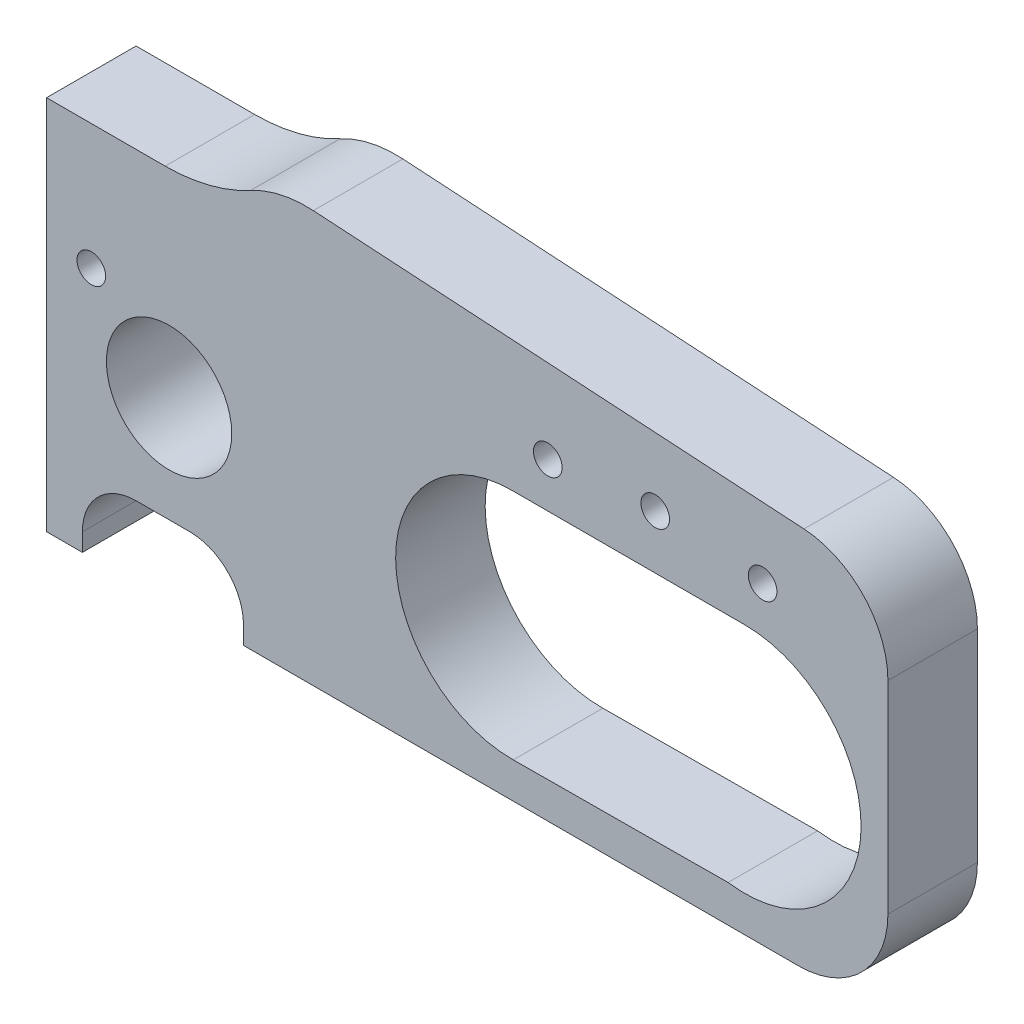
ISO-10303-21;
HEADER;
FILE_DESCRIPTION(('STEP AP214'),'2;1');
FILE_NAME('part.step','',(''),(''),'','','');
FILE_SCHEMA(('AUTOMOTIVE_DESIGN { 1 0 10303 214 1 1 1 1 }'));
ENDSEC;
DATA;
#1=APPLICATION_CONTEXT('core data for automotive mechanical design processes');
#2=APPLICATION_PROTOCOL_DEFINITION('international standard','automotive_design',2000,#1);
#3=PRODUCT_CONTEXT('',#1,'mechanical');
#4=PRODUCT('Part','Part','',(#3));
#5=PRODUCT_RELATED_PRODUCT_CATEGORY('part','',(#4));
#6=PRODUCT_DEFINITION_FORMATION('','',#4);
#7=PRODUCT_DEFINITION_CONTEXT('part definition',#1,'design');
#8=PRODUCT_DEFINITION('design','',#6,#7);
#9=PRODUCT_DEFINITION_SHAPE('','',#8);
#10=(LENGTH_UNIT() NAMED_UNIT(*) SI_UNIT(.MILLI.,.METRE.));
#11=(NAMED_UNIT(*) PLANE_ANGLE_UNIT() SI_UNIT($,.RADIAN.));
#12=(NAMED_UNIT(*) SI_UNIT($,.STERADIAN.) SOLID_ANGLE_UNIT());
#13=UNCERTAINTY_MEASURE_WITH_UNIT(LENGTH_MEASURE(1.E-05),#10,'distance_accuracy_value','');
#14=(GEOMETRIC_REPRESENTATION_CONTEXT(3) GLOBAL_UNCERTAINTY_ASSIGNED_CONTEXT((#13)) GLOBAL_UNIT_ASSIGNED_CONTEXT((#10,
#11,#12)) REPRESENTATION_CONTEXT('',''));
#15=CARTESIAN_POINT('',(0.,0.,0.));
#16=DIRECTION('',(0.,0.,1.));
#17=DIRECTION('',(1.,0.,0.));
#18=AXIS2_PLACEMENT_3D('',#15,#16,#17);
#19=CARTESIAN_POINT('',(0.,-8.37631575705552,5.));
#20=DIRECTION('',(0.,1.,0.));
#21=DIRECTION('',(-1.,0.,0.));
#22=AXIS2_PLACEMENT_3D('',#19,#20,#21);
#23=PLANE('',#22);
#24=DIRECTION('',(0.,0.,-1.));
#25=VECTOR('',#24,1.);
#26=CARTESIAN_POINT('',(-21.9381578785278,-8.37631575705552,10.));
#27=LINE('',#26,#25);
#28=CARTESIAN_POINT('',(-21.9381578785278,-8.37631575705552,5.));
#29=VERTEX_POINT('',#28);
#30=CARTESIAN_POINT('',(-21.9381578785278,-8.37631575705552,0.));
#31=VERTEX_POINT('',#30);
#32=EDGE_CURVE('E187',#29,#31,#27,.T.);
#33=ORIENTED_EDGE('',*,*,#32,.F.);
#34=DIRECTION('',(1.,0.,0.));
#35=VECTOR('',#34,1.);
#36=CARTESIAN_POINT('',(0.,-8.37631575705552,5.));
#37=LINE('',#36,#35);
#38=CARTESIAN_POINT('',(-23.9381578785278,-8.37631575705552,5.));
#39=VERTEX_POINT('',#38);
#40=EDGE_CURVE('E331',#39,#29,#37,.T.);
#41=ORIENTED_EDGE('',*,*,#40,.F.);
#42=DIRECTION('',(0.,0.,-1.));
#43=VECTOR('',#42,1.);
#44=CARTESIAN_POINT('',(-23.9381578785278,-8.37631575705552,5.));
#45=LINE('',#44,#43);
#46=CARTESIAN_POINT('',(-23.9381578785278,-8.37631575705552,0.));
#47=VERTEX_POINT('',#46);
#48=EDGE_CURVE('E211',#39,#47,#45,.T.);
#49=ORIENTED_EDGE('',*,*,#48,.T.);
#50=DIRECTION('',(1.,0.,0.));
#51=VECTOR('',#50,1.);
#52=CARTESIAN_POINT('',(0.,-8.37631575705552,0.));
#53=LINE('',#52,#51);
#54=EDGE_CURVE('E198',#47,#31,#53,.T.);
#55=ORIENTED_EDGE('',*,*,#54,.T.);
#56=EDGE_LOOP('',(#33,#41,#49,#55));
#57=FACE_BOUND('',#56,.T.);
#58=ADVANCED_FACE('F45',(#57),#23,.F.);
#59=CARTESIAN_POINT('',(0.,0.,0.));
#60=DIRECTION('',(0.,0.,1.));
#61=DIRECTION('',(1.,0.,0.));
#62=AXIS2_PLACEMENT_3D('',#59,#60,#61);
#63=PLANE('',#62);
#64=CARTESIAN_POINT('',(-21.4381578785278,5.62368424294448,0.));
#65=DIRECTION('',(0.,0.,1.));
#66=DIRECTION('',(1.,0.,0.));
#67=AXIS2_PLACEMENT_3D('',#64,#65,#66);
#68=CIRCLE('',#67,0.8);
#69=CARTESIAN_POINT('',(-20.6381578785278,5.62368424294448,0.));
#70=VERTEX_POINT('',#69);
#71=EDGE_CURVE('E364',#70,#70,#68,.T.);
#72=ORIENTED_EDGE('',*,*,#71,.T.);
#73=EDGE_LOOP('',(#72));
#74=FACE_BOUND('',#73,.T.);
#75=CARTESIAN_POINT('',(4.06184212147224,9.12368424294448,0.));
#76=DIRECTION('',(0.,0.,1.));
#77=DIRECTION('',(1.,0.,0.));
#78=AXIS2_PLACEMENT_3D('',#75,#76,#77);
#79=CIRCLE('',#78,0.800000000000001);
#80=CARTESIAN_POINT('',(4.86184212147224,9.12368424294448,0.));
#81=VERTEX_POINT('',#80);
#82=EDGE_CURVE('E358',#81,#81,#79,.T.);
#83=ORIENTED_EDGE('',*,*,#82,.T.);
#84=EDGE_LOOP('',(#83));
#85=FACE_BOUND('',#84,.T.);
#86=CARTESIAN_POINT('',(10.0618421214722,9.62368424294448,0.));
#87=DIRECTION('',(0.,0.,1.));
#88=DIRECTION('',(1.,0.,0.));
#89=AXIS2_PLACEMENT_3D('',#86,#87,#88);
#90=CIRCLE('',#89,0.800000000000002);
#91=CARTESIAN_POINT('',(10.8618421214722,9.62368424294448,0.));
#92=VERTEX_POINT('',#91);
#93=EDGE_CURVE('E360',#92,#92,#90,.T.);
#94=ORIENTED_EDGE('',*,*,#93,.T.);
#95=EDGE_LOOP('',(#94));
#96=FACE_BOUND('',#95,.T.);
#97=CARTESIAN_POINT('',(16.0618421214722,9.12368424294448,0.));
#98=DIRECTION('',(0.,0.,1.));
#99=DIRECTION('',(1.,0.,0.));
#100=AXIS2_PLACEMENT_3D('',#97,#98,#99);
#101=CIRCLE('',#100,0.8);
#102=CARTESIAN_POINT('',(16.8618421214722,9.12368424294448,0.));
#103=VERTEX_POINT('',#102);
#104=EDGE_CURVE('E353',#103,#103,#101,.T.);
#105=ORIENTED_EDGE('',*,*,#104,.T.);
#106=EDGE_LOOP('',(#105));
#107=FACE_BOUND('',#106,.T.);
#108=CARTESIAN_POINT('',(15.0618421214712,0.123684242944485,0.));
#109=DIRECTION('',(0.,0.,1.));
#110=DIRECTION('',(1.,0.,0.));
#111=AXIS2_PLACEMENT_3D('',#108,#109,#110);
#112=CIRCLE('',#111,6.5);
#113=CARTESIAN_POINT('',(14.1329018950054,-6.30959408584354,0.));
#114=VERTEX_POINT('',#113);
#115=CARTESIAN_POINT('',(15.0618421214722,6.62368424294448,0.));
#116=VERTEX_POINT('',#115);
#117=EDGE_CURVE('E345',#114,#116,#112,.T.);
#118=ORIENTED_EDGE('',*,*,#117,.T.);
#119=DIRECTION('',(-1.,0.,0.));
#120=VECTOR('',#119,1.);
#121=CARTESIAN_POINT('',(0.,6.62368424294448,0.));
#122=LINE('',#121,#120);
#123=CARTESIAN_POINT('',(2.06184212147224,6.62368424294448,0.));
#124=VERTEX_POINT('',#123);
#125=EDGE_CURVE('E351',#116,#124,#122,.T.);
#126=ORIENTED_EDGE('',*,*,#125,.T.);
#127=CARTESIAN_POINT('',(2.06184212147224,0.123684242944485,0.));
#128=DIRECTION('',(0.,0.,1.));
#129=DIRECTION('',(1.,0.,0.));
#130=AXIS2_PLACEMENT_3D('',#127,#128,#129);
#131=CIRCLE('',#130,6.5);
#132=CARTESIAN_POINT('',(2.13369622893157,-6.37591859009395,0.));
#133=VERTEX_POINT('',#132);
#134=EDGE_CURVE('E348',#124,#133,#131,.T.);
#135=ORIENTED_EDGE('',*,*,#134,.T.);
#136=DIRECTION('',(0.999984724230958,0.00552732346942933,0.));
#137=VECTOR('',#136,1.);
#138=CARTESIAN_POINT('',(0.035306413320846,-6.38751724654818,0.));
#139=LINE('',#138,#137);
#140=EDGE_CURVE('E344',#133,#114,#139,.T.);
#141=ORIENTED_EDGE('',*,*,#140,.T.);
#142=EDGE_LOOP('',(#118,#126,#135,#141));
#143=FACE_BOUND('',#142,.T.);
#144=CARTESIAN_POINT('',(-9.43815787852776,8.12368424294449,0.));
#145=DIRECTION('',(0.,0.,1.));
#146=DIRECTION('',(1.,0.,0.));
#147=AXIS2_PLACEMENT_3D('',#144,#145,#146);
#148=CIRCLE('',#147,5.1);
#149=CARTESIAN_POINT('',(-4.33815787852776,8.12368424294449,0.));
#150=VERTEX_POINT('',#149);
#151=EDGE_CURVE('E339',#150,#150,#148,.T.);
#152=ORIENTED_EDGE('',*,*,#151,.T.);
#153=EDGE_LOOP('',(#152));
#154=FACE_BOUND('',#153,.T.);
#155=CARTESIAN_POINT('',(-17.0949123880256,1.5370226924151,0.));
#156=DIRECTION('',(0.,0.,1.));
#157=DIRECTION('',(1.,0.,0.));
#158=AXIS2_PLACEMENT_3D('',#155,#156,#157);
#159=CIRCLE('',#158,3.49999999999997);
#160=CARTESIAN_POINT('',(-13.5949123880256,1.5370226924151,0.));
#161=VERTEX_POINT('',#160);
#162=EDGE_CURVE('E277',#161,#161,#159,.T.);
#163=ORIENTED_EDGE('',*,*,#162,.T.);
#164=EDGE_LOOP('',(#163));
#165=FACE_BOUND('',#164,.T.);
#166=DIRECTION('',(0.,-1.,0.));
#167=VECTOR('',#166,1.);
#168=CARTESIAN_POINT('',(-12.9381578785278,-8.37631575705552,0.));
#169=LINE('',#168,#167);
#170=CARTESIAN_POINT('',(-12.9381578785278,-7.37631575705552,0.));
#171=VERTEX_POINT('',#170);
#172=CARTESIAN_POINT('',(-12.9381578785278,-8.37631575705552,0.));
#173=VERTEX_POINT('',#172);
#174=EDGE_CURVE('E174',#171,#173,#169,.T.);
#175=ORIENTED_EDGE('',*,*,#174,.F.);
#176=CARTESIAN_POINT('',(-15.9381578785278,-7.37631575705552,0.));
#177=DIRECTION('',(0.,0.,1.));
#178=DIRECTION('',(1.,0.,0.));
#179=AXIS2_PLACEMENT_3D('',#176,#177,#178);
#180=CIRCLE('',#179,3.);
#181=CARTESIAN_POINT('',(-15.9381578785278,-4.37631575705552,0.));
#182=VERTEX_POINT('',#181);
#183=EDGE_CURVE('E250',#171,#182,#180,.T.);
#184=ORIENTED_EDGE('',*,*,#183,.T.);
#185=DIRECTION('',(1.,0.,0.));
#186=VECTOR('',#185,1.);
#187=CARTESIAN_POINT('',(-21.9381578785278,-4.37631575705552,0.));
#188=LINE('',#187,#186);
#189=CARTESIAN_POINT('',(-18.9381578785278,-4.37631575705552,0.));
#190=VERTEX_POINT('',#189);
#191=EDGE_CURVE('E191',#190,#182,#188,.T.);
#192=ORIENTED_EDGE('',*,*,#191,.F.);
#193=CARTESIAN_POINT('',(-18.9381578785278,-7.37631575705552,0.));
#194=DIRECTION('',(0.,0.,1.));
#195=DIRECTION('',(1.,0.,0.));
#196=AXIS2_PLACEMENT_3D('',#193,#194,#195);
#197=CIRCLE('',#196,3.);
#198=CARTESIAN_POINT('',(-21.9381578785278,-7.37631575705552,0.));
#199=VERTEX_POINT('',#198);
#200=EDGE_CURVE('E49',#190,#199,#197,.T.);
#201=ORIENTED_EDGE('',*,*,#200,.T.);
#202=DIRECTION('',(0.,1.,0.));
#203=VECTOR('',#202,1.);
#204=CARTESIAN_POINT('',(-21.9381578785278,-8.37631575705552,0.));
#205=LINE('',#204,#203);
#206=EDGE_CURVE('E183',#31,#199,#205,.T.);
#207=ORIENTED_EDGE('',*,*,#206,.F.);
#208=ORIENTED_EDGE('',*,*,#54,.F.);
#209=DIRECTION('',(0.,1.,0.));
#210=VECTOR('',#209,1.);
#211=CARTESIAN_POINT('',(-23.9381578785278,0.,0.));
#212=LINE('',#211,#210);
#213=CARTESIAN_POINT('',(-23.9381578785278,12.6236842429445,0.));
#214=VERTEX_POINT('',#213);
#215=EDGE_CURVE('E197',#47,#214,#212,.T.);
#216=ORIENTED_EDGE('',*,*,#215,.T.);
#217=DIRECTION('',(1.,0.,0.));
#218=VECTOR('',#217,1.);
#219=CARTESIAN_POINT('',(0.,12.6236842429445,0.));
#220=LINE('',#219,#218);
#221=CARTESIAN_POINT('',(-17.3121657525395,12.6236842429445,0.));
#222=VERTEX_POINT('',#221);
#223=EDGE_CURVE('E202',#214,#222,#220,.T.);
#224=ORIENTED_EDGE('',*,*,#223,.T.);
#225=CARTESIAN_POINT('',(-17.3121657525396,22.6236842429445,0.));
#226=DIRECTION('',(0.,0.,1.));
#227=DIRECTION('',(1.,0.,0.));
#228=AXIS2_PLACEMENT_3D('',#225,#226,#227);
#229=CIRCLE('',#228,10.);
#230=CARTESIAN_POINT('',(-12.54003976829,13.8358054550657,0.));
#231=VERTEX_POINT('',#230);
#232=EDGE_CURVE('E380',#222,#231,#229,.T.);
#233=ORIENTED_EDGE('',*,*,#232,.T.);
#234=CARTESIAN_POINT('',(-9.43815787852776,8.12368424294449,0.));
#235=DIRECTION('',(0.,0.,1.));
#236=DIRECTION('',(1.,0.,0.));
#237=AXIS2_PLACEMENT_3D('',#234,#235,#236);
#238=CIRCLE('',#237,6.49999999999999);
#239=CARTESIAN_POINT('',(-9.03643740082861,14.6112585706726,0.));
#240=VERTEX_POINT('',#239);
#241=EDGE_CURVE('E375',#240,#231,#238,.T.);
#242=ORIENTED_EDGE('',*,*,#241,.F.);
#243=DIRECTION('',(-0.998088358112021,0.0618031504152585,0.));
#244=VECTOR('',#243,1.);
#245=CARTESIAN_POINT('',(0.866779714900697,13.9980362922802,0.));
#246=LINE('',#245,#244);
#247=CARTESIAN_POINT('',(18.3708578735485,12.9141571281492,0.));
#248=VERTEX_POINT('',#247);
#249=EDGE_CURVE('E373',#248,#240,#246,.T.);
#250=ORIENTED_EDGE('',*,*,#249,.F.);
#251=CARTESIAN_POINT('',(18.0618421214722,7.9237153375891,0.));
#252=DIRECTION('',(0.,0.,1.));
#253=DIRECTION('',(1.,0.,0.));
#254=AXIS2_PLACEMENT_3D('',#251,#252,#253);
#255=CIRCLE('',#254,5.);
#256=CARTESIAN_POINT('',(23.0618421214722,7.92371533758916,0.));
#257=VERTEX_POINT('',#256);
#258=EDGE_CURVE('E369',#257,#248,#255,.T.);
#259=ORIENTED_EDGE('',*,*,#258,.F.);
#260=DIRECTION('',(0.,-1.,0.));
#261=VECTOR('',#260,1.);
#262=CARTESIAN_POINT('',(23.0618421214722,0.,0.));
#263=LINE('',#262,#261);
#264=CARTESIAN_POINT('',(23.0618421214722,-3.37631575705552,0.));
#265=VERTEX_POINT('',#264);
#266=EDGE_CURVE('E367',#257,#265,#263,.T.);
#267=ORIENTED_EDGE('',*,*,#266,.T.);
#268=CARTESIAN_POINT('',(18.0618421214722,-3.37631575705552,0.));
#269=DIRECTION('',(0.,0.,1.));
#270=DIRECTION('',(1.,0.,0.));
#271=AXIS2_PLACEMENT_3D('',#268,#269,#270);
#272=CIRCLE('',#271,5.);
#273=CARTESIAN_POINT('',(18.0618421214723,-8.37631575705552,0.));
#274=VERTEX_POINT('',#273);
#275=EDGE_CURVE('E196',#274,#265,#272,.T.);
#276=ORIENTED_EDGE('',*,*,#275,.F.);
#277=EDGE_CURVE('E190',#173,#274,#53,.T.);
#278=ORIENTED_EDGE('',*,*,#277,.F.);
#279=EDGE_LOOP('',(#175,#184,#192,#201,#207,#208,#216,#224,#233,#242,#250,#259,#267,#276,#278));
#280=FACE_BOUND('',#279,.T.);
#281=ADVANCED_FACE('F193',(#74,#85,#96,#107,#143,#154,#165,#280),#63,.F.);
#282=CARTESIAN_POINT('',(-9.43815787852776,8.12368424294449,5.));
#283=DIRECTION('',(0.,0.,-1.));
#284=DIRECTION('',(-1.,0.,0.));
#285=AXIS2_PLACEMENT_3D('',#282,#283,#284);
#286=CYLINDRICAL_SURFACE('',#285,5.1);
#287=ORIENTED_EDGE('',*,*,#151,.F.);
#288=EDGE_LOOP('',(#287));
#289=FACE_BOUND('',#288,.T.);
#290=CARTESIAN_POINT('',(-9.43815787852776,8.12368424294449,4.));
#291=DIRECTION('',(0.,0.,1.));
#292=DIRECTION('',(1.,0.,0.));
#293=AXIS2_PLACEMENT_3D('',#290,#291,#292);
#294=CIRCLE('',#293,5.1);
#295=CARTESIAN_POINT('',(-4.33815787852776,8.12368424294449,4.));
#296=VERTEX_POINT('',#295);
#297=EDGE_CURVE('E271',#296,#296,#294,.T.);
#298=ORIENTED_EDGE('',*,*,#297,.T.);
#299=EDGE_LOOP('',(#298));
#300=FACE_BOUND('',#299,.T.);
#301=ADVANCED_FACE('F428',(#289,#300),#286,.F.);
#302=CARTESIAN_POINT('',(23.0618421214722,0.,5.));
#303=DIRECTION('',(1.,0.,0.));
#304=DIRECTION('',(0.,0.,-1.));
#305=AXIS2_PLACEMENT_3D('',#302,#303,#304);
#306=PLANE('',#305);
#307=ORIENTED_EDGE('',*,*,#266,.F.);
#308=DIRECTION('',(0.,0.,-1.));
#309=VECTOR('',#308,1.);
#310=CARTESIAN_POINT('',(23.0618421214722,7.92371533758916,5.));
#311=LINE('',#310,#309);
#312=CARTESIAN_POINT('',(23.0618421214722,7.92371533758916,5.));
#313=VERTEX_POINT('',#312);
#314=EDGE_CURVE('E229',#313,#257,#311,.T.);
#315=ORIENTED_EDGE('',*,*,#314,.F.);
#316=DIRECTION('',(0.,-1.,0.));
#317=VECTOR('',#316,1.);
#318=CARTESIAN_POINT('',(23.0618421214722,0.,5.));
#319=LINE('',#318,#317);
#320=CARTESIAN_POINT('',(23.0618421214722,-3.37631575705552,5.));
#321=VERTEX_POINT('',#320);
#322=EDGE_CURVE('E314',#313,#321,#319,.T.);
#323=ORIENTED_EDGE('',*,*,#322,.T.);
#324=DIRECTION('',(0.,0.,-1.));
#325=VECTOR('',#324,1.);
#326=CARTESIAN_POINT('',(23.0618421214722,-3.37631575705552,5.));
#327=LINE('',#326,#325);
#328=EDGE_CURVE('E206',#321,#265,#327,.T.);
#329=ORIENTED_EDGE('',*,*,#328,.T.);
#330=EDGE_LOOP('',(#307,#315,#323,#329));
#331=FACE_BOUND('',#330,.T.);
#332=ADVANCED_FACE('F401',(#331),#306,.T.);
#333=CARTESIAN_POINT('',(18.0618421214722,7.9237153375891,5.));
#334=DIRECTION('',(0.,0.,-1.));
#335=DIRECTION('',(-1.,0.,0.));
#336=AXIS2_PLACEMENT_3D('',#333,#334,#335);
#337=CYLINDRICAL_SURFACE('',#336,5.);
#338=ORIENTED_EDGE('',*,*,#258,.T.);
#339=DIRECTION('',(0.,0.,-1.));
#340=VECTOR('',#339,1.);
#341=CARTESIAN_POINT('',(18.3708578735485,12.9141571281492,5.));
#342=LINE('',#341,#340);
#343=CARTESIAN_POINT('',(18.3708578735485,12.9141571281492,5.));
#344=VERTEX_POINT('',#343);
#345=EDGE_CURVE('E221',#344,#248,#342,.T.);
#346=ORIENTED_EDGE('',*,*,#345,.F.);
#347=CARTESIAN_POINT('',(18.0618421214722,7.9237153375891,5.));
#348=DIRECTION('',(0.,0.,1.));
#349=DIRECTION('',(1.,0.,0.));
#350=AXIS2_PLACEMENT_3D('',#347,#348,#349);
#351=CIRCLE('',#350,5.);
#352=EDGE_CURVE('E317',#313,#344,#351,.T.);
#353=ORIENTED_EDGE('',*,*,#352,.F.);
#354=ORIENTED_EDGE('',*,*,#314,.T.);
#355=EDGE_LOOP('',(#338,#346,#353,#354));
#356=FACE_BOUND('',#355,.T.);
#357=ADVANCED_FACE('F402',(#356),#337,.T.);
#358=CARTESIAN_POINT('',(0.866779714900697,13.9980362922802,5.));
#359=DIRECTION('',(-0.0618031504152585,-0.998088358112021,0.));
#360=DIRECTION('',(0.998088358112021,-0.0618031504152585,0.));
#361=AXIS2_PLACEMENT_3D('',#358,#359,#360);
#362=PLANE('',#361);
#363=ORIENTED_EDGE('',*,*,#249,.T.);
#364=DIRECTION('',(0.,0.,-1.));
#365=VECTOR('',#364,1.);
#366=CARTESIAN_POINT('',(-9.03643740082861,14.6112585706726,5.));
#367=LINE('',#366,#365);
#368=CARTESIAN_POINT('',(-9.03643740082861,14.6112585706726,5.));
#369=VERTEX_POINT('',#368);
#370=EDGE_CURVE('E224',#369,#240,#367,.T.);
#371=ORIENTED_EDGE('',*,*,#370,.F.);
#372=DIRECTION('',(-0.998088358112021,0.0618031504152585,0.));
#373=VECTOR('',#372,1.);
#374=CARTESIAN_POINT('',(0.866779714900697,13.9980362922802,5.));
#375=LINE('',#374,#373);
#376=EDGE_CURVE('E316',#344,#369,#375,.T.);
#377=ORIENTED_EDGE('',*,*,#376,.F.);
#378=ORIENTED_EDGE('',*,*,#345,.T.);
#379=EDGE_LOOP('',(#363,#371,#377,#378));
#380=FACE_BOUND('',#379,.T.);
#381=ADVANCED_FACE('F397',(#380),#362,.F.);
#382=CARTESIAN_POINT('',(-9.43815787852776,8.12368424294449,5.));
#383=DIRECTION('',(0.,0.,-1.));
#384=DIRECTION('',(-1.,0.,0.));
#385=AXIS2_PLACEMENT_3D('',#382,#383,#384);
#386=CYLINDRICAL_SURFACE('',#385,6.49999999999999);
#387=ORIENTED_EDGE('',*,*,#241,.T.);
#388=DIRECTION('',(0.,0.,-1.));
#389=VECTOR('',#388,1.);
#390=CARTESIAN_POINT('',(-12.54003976829,13.8358054550657,5.));
#391=LINE('',#390,#389);
#392=CARTESIAN_POINT('',(-12.54003976829,13.8358054550657,5.));
#393=VERTEX_POINT('',#392);
#394=EDGE_CURVE('E218',#393,#231,#391,.T.);
#395=ORIENTED_EDGE('',*,*,#394,.F.);
#396=CARTESIAN_POINT('',(-9.43815787852776,8.12368424294449,5.));
#397=DIRECTION('',(0.,0.,1.));
#398=DIRECTION('',(1.,0.,0.));
#399=AXIS2_PLACEMENT_3D('',#396,#397,#398);
#400=CIRCLE('',#399,6.49999999999999);
#401=EDGE_CURVE('E324',#369,#393,#400,.T.);
#402=ORIENTED_EDGE('',*,*,#401,.F.);
#403=ORIENTED_EDGE('',*,*,#370,.T.);
#404=EDGE_LOOP('',(#387,#395,#402,#403));
#405=FACE_BOUND('',#404,.T.);
#406=ADVANCED_FACE('F395',(#405),#386,.T.);
#407=CARTESIAN_POINT('',(-17.3121657525396,22.6236842429445,5.));
#408=DIRECTION('',(0.,0.,-1.));
#409=DIRECTION('',(-1.,0.,0.));
#410=AXIS2_PLACEMENT_3D('',#407,#408,#409);
#411=CYLINDRICAL_SURFACE('',#410,10.);
#412=ORIENTED_EDGE('',*,*,#232,.F.);
#413=DIRECTION('',(0.,0.,-1.));
#414=VECTOR('',#413,1.);
#415=CARTESIAN_POINT('',(-17.3121657525395,12.6236842429445,5.));
#416=LINE('',#415,#414);
#417=CARTESIAN_POINT('',(-17.3121657525395,12.6236842429445,5.));
#418=VERTEX_POINT('',#417);
#419=EDGE_CURVE('E219',#418,#222,#416,.T.);
#420=ORIENTED_EDGE('',*,*,#419,.F.);
#421=CARTESIAN_POINT('',(-17.3121657525396,22.6236842429445,5.));
#422=DIRECTION('',(0.,0.,1.));
#423=DIRECTION('',(1.,0.,0.));
#424=AXIS2_PLACEMENT_3D('',#421,#422,#423);
#425=CIRCLE('',#424,10.);
#426=EDGE_CURVE('E325',#418,#393,#425,.T.);
#427=ORIENTED_EDGE('',*,*,#426,.T.);
#428=ORIENTED_EDGE('',*,*,#394,.T.);
#429=EDGE_LOOP('',(#412,#420,#427,#428));
#430=FACE_BOUND('',#429,.T.);
#431=ADVANCED_FACE('F386',(#430),#411,.F.);
#432=CARTESIAN_POINT('',(0.,12.6236842429445,5.));
#433=DIRECTION('',(0.,1.,0.));
#434=DIRECTION('',(-1.,0.,0.));
#435=AXIS2_PLACEMENT_3D('',#432,#433,#434);
#436=PLANE('',#435);
#437=ORIENTED_EDGE('',*,*,#223,.F.);
#438=DIRECTION('',(0.,0.,-1.));
#439=VECTOR('',#438,1.);
#440=CARTESIAN_POINT('',(-23.9381578785278,12.6236842429445,5.));
#441=LINE('',#440,#439);
#442=CARTESIAN_POINT('',(-23.9381578785278,12.6236842429445,5.));
#443=VERTEX_POINT('',#442);
#444=EDGE_CURVE('E217',#443,#214,#441,.T.);
#445=ORIENTED_EDGE('',*,*,#444,.F.);
#446=DIRECTION('',(1.,0.,0.));
#447=VECTOR('',#446,1.);
#448=CARTESIAN_POINT('',(0.,12.6236842429445,5.));
#449=LINE('',#448,#447);
#450=EDGE_CURVE('E330',#443,#418,#449,.T.);
#451=ORIENTED_EDGE('',*,*,#450,.T.);
#452=ORIENTED_EDGE('',*,*,#419,.T.);
#453=EDGE_LOOP('',(#437,#445,#451,#452));
#454=FACE_BOUND('',#453,.T.);
#455=ADVANCED_FACE('F383',(#454),#436,.T.);
#456=CARTESIAN_POINT('',(-23.9381578785278,0.,5.));
#457=DIRECTION('',(-1.,0.,0.));
#458=DIRECTION('',(0.,0.,1.));
#459=AXIS2_PLACEMENT_3D('',#456,#457,#458);
#460=PLANE('',#459);
#461=CARTESIAN_POINT('',(-23.9381578785278,9.62368424294448,2.5));
#462=DIRECTION('',(-1.,0.,0.));
#463=DIRECTION('',(0.,0.,1.));
#464=AXIS2_PLACEMENT_3D('',#461,#462,#463);
#465=CIRCLE('',#464,1.25);
#466=CARTESIAN_POINT('',(-23.9381578785278,9.62368424294448,3.75));
#467=VERTEX_POINT('',#466);
#468=EDGE_CURVE('E278',#467,#467,#465,.T.);
#469=ORIENTED_EDGE('',*,*,#468,.F.);
#470=EDGE_LOOP('',(#469));
#471=FACE_BOUND('',#470,.T.);
#472=CARTESIAN_POINT('',(-23.9381578785278,-2.87631575705552,2.5));
#473=DIRECTION('',(-1.,0.,0.));
#474=DIRECTION('',(0.,0.,1.));
#475=AXIS2_PLACEMENT_3D('',#472,#473,#474);
#476=CIRCLE('',#475,1.25);
#477=CARTESIAN_POINT('',(-23.9381578785278,-2.87631575705552,3.75));
#478=VERTEX_POINT('',#477);
#479=EDGE_CURVE('E285',#478,#478,#476,.T.);
#480=ORIENTED_EDGE('',*,*,#479,.F.);
#481=EDGE_LOOP('',(#480));
#482=FACE_BOUND('',#481,.T.);
#483=ORIENTED_EDGE('',*,*,#215,.F.);
#484=ORIENTED_EDGE('',*,*,#48,.F.);
#485=DIRECTION('',(0.,1.,0.));
#486=VECTOR('',#485,1.);
#487=CARTESIAN_POINT('',(-23.9381578785278,0.,5.));
#488=LINE('',#487,#486);
#489=EDGE_CURVE('E328',#39,#443,#488,.T.);
#490=ORIENTED_EDGE('',*,*,#489,.T.);
#491=ORIENTED_EDGE('',*,*,#444,.T.);
#492=EDGE_LOOP('',(#483,#484,#490,#491));
#493=FACE_BOUND('',#492,.T.);
#494=ADVANCED_FACE('F413',(#471,#482,#493),#460,.T.);
#495=CARTESIAN_POINT('',(-12.9381578785278,-8.37631575705552,5.));
#496=VERTEX_POINT('',#495);
#497=CARTESIAN_POINT('',(18.0618421214723,-8.37631575705552,5.));
#498=VERTEX_POINT('',#497);
#499=EDGE_CURVE('E189',#496,#498,#37,.T.);
#500=ORIENTED_EDGE('',*,*,#499,.F.);
#501=DIRECTION('',(0.,0.,-1.));
#502=VECTOR('',#501,1.);
#503=CARTESIAN_POINT('',(-12.9381578785278,-8.37631575705552,10.));
#504=LINE('',#503,#502);
#505=EDGE_CURVE('E177',#496,#173,#504,.T.);
#506=ORIENTED_EDGE('',*,*,#505,.T.);
#507=ORIENTED_EDGE('',*,*,#277,.T.);
#508=DIRECTION('',(0.,0.,-1.));
#509=VECTOR('',#508,1.);
#510=CARTESIAN_POINT('',(18.0618421214723,-8.37631575705552,5.));
#511=LINE('',#510,#509);
#512=EDGE_CURVE('E212',#498,#274,#511,.T.);
#513=ORIENTED_EDGE('',*,*,#512,.F.);
#514=EDGE_LOOP('',(#500,#506,#507,#513));
#515=FACE_BOUND('',#514,.T.);
#516=ADVANCED_FACE('F184',(#515),#23,.F.);
#517=CARTESIAN_POINT('',(15.0618421214712,0.123684242944485,5.));
#518=DIRECTION('',(0.,0.,-1.));
#519=DIRECTION('',(-1.,0.,0.));
#520=AXIS2_PLACEMENT_3D('',#517,#518,#519);
#521=CYLINDRICAL_SURFACE('',#520,6.5);
#522=ORIENTED_EDGE('',*,*,#117,.F.);
#523=DIRECTION('',(0.,0.,-1.));
#524=VECTOR('',#523,1.);
#525=CARTESIAN_POINT('',(14.1329018950054,-6.30959408584354,5.));
#526=LINE('',#525,#524);
#527=CARTESIAN_POINT('',(14.1329018950054,-6.30959408584354,5.));
#528=VERTEX_POINT('',#527);
#529=EDGE_CURVE('E215',#528,#114,#526,.T.);
#530=ORIENTED_EDGE('',*,*,#529,.F.);
#531=CARTESIAN_POINT('',(15.0618421214712,0.123684242944485,5.));
#532=DIRECTION('',(0.,0.,1.));
#533=DIRECTION('',(1.,0.,0.));
#534=AXIS2_PLACEMENT_3D('',#531,#532,#533);
#535=CIRCLE('',#534,6.5);
#536=CARTESIAN_POINT('',(15.0618421214722,6.62368424294448,5.));
#537=VERTEX_POINT('',#536);
#538=EDGE_CURVE('E286',#528,#537,#535,.T.);
#539=ORIENTED_EDGE('',*,*,#538,.T.);
#540=DIRECTION('',(0.,0.,-1.));
#541=VECTOR('',#540,1.);
#542=CARTESIAN_POINT('',(15.0618421214722,6.62368424294448,5.));
#543=LINE('',#542,#541);
#544=EDGE_CURVE('E232',#537,#116,#543,.T.);
#545=ORIENTED_EDGE('',*,*,#544,.T.);
#546=EDGE_LOOP('',(#522,#530,#539,#545));
#547=FACE_BOUND('',#546,.T.);
#548=ADVANCED_FACE('F431',(#547),#521,.F.);
#549=CARTESIAN_POINT('',(0.035306413320846,-6.38751724654818,5.));
#550=DIRECTION('',(-0.00552732346942933,0.999984724230958,0.));
#551=DIRECTION('',(-0.999984724230958,-0.00552732346942933,0.));
#552=AXIS2_PLACEMENT_3D('',#549,#550,#551);
#553=PLANE('',#552);
#554=ORIENTED_EDGE('',*,*,#140,.F.);
#555=DIRECTION('',(0.,0.,-1.));
#556=VECTOR('',#555,1.);
#557=CARTESIAN_POINT('',(2.13369622893157,-6.37591859009395,5.));
#558=LINE('',#557,#556);
#559=CARTESIAN_POINT('',(2.13369622893157,-6.37591859009395,5.));
#560=VERTEX_POINT('',#559);
#561=EDGE_CURVE('E237',#560,#133,#558,.T.);
#562=ORIENTED_EDGE('',*,*,#561,.F.);
#563=DIRECTION('',(0.999984724230958,0.00552732346942933,0.));
#564=VECTOR('',#563,1.);
#565=CARTESIAN_POINT('',(0.035306413320846,-6.38751724654818,5.));
#566=LINE('',#565,#564);
#567=EDGE_CURVE('E295',#560,#528,#566,.T.);
#568=ORIENTED_EDGE('',*,*,#567,.T.);
#569=ORIENTED_EDGE('',*,*,#529,.T.);
#570=EDGE_LOOP('',(#554,#562,#568,#569));
#571=FACE_BOUND('',#570,.T.);
#572=ADVANCED_FACE('F439',(#571),#553,.T.);
#573=CARTESIAN_POINT('',(2.06184212147224,0.123684242944485,5.));
#574=DIRECTION('',(0.,0.,-1.));
#575=DIRECTION('',(-1.,0.,0.));
#576=AXIS2_PLACEMENT_3D('',#573,#574,#575);
#577=CYLINDRICAL_SURFACE('',#576,6.5);
#578=ORIENTED_EDGE('',*,*,#134,.F.);
#579=DIRECTION('',(0.,0.,-1.));
#580=VECTOR('',#579,1.);
#581=CARTESIAN_POINT('',(2.06184212147224,6.62368424294448,5.));
#582=LINE('',#581,#580);
#583=CARTESIAN_POINT('',(2.06184212147224,6.62368424294448,5.));
#584=VERTEX_POINT('',#583);
#585=EDGE_CURVE('E231',#584,#124,#582,.T.);
#586=ORIENTED_EDGE('',*,*,#585,.F.);
#587=CARTESIAN_POINT('',(2.06184212147224,0.123684242944485,5.));
#588=DIRECTION('',(0.,0.,1.));
#589=DIRECTION('',(1.,0.,0.));
#590=AXIS2_PLACEMENT_3D('',#587,#588,#589);
#591=CIRCLE('',#590,6.5);
#592=EDGE_CURVE('E293',#584,#560,#591,.T.);
#593=ORIENTED_EDGE('',*,*,#592,.T.);
#594=ORIENTED_EDGE('',*,*,#561,.T.);
#595=EDGE_LOOP('',(#578,#586,#593,#594));
#596=FACE_BOUND('',#595,.T.);
#597=ADVANCED_FACE('F467',(#596),#577,.F.);
#598=CARTESIAN_POINT('',(-21.4381578785278,5.62368424294448,5.));
#599=DIRECTION('',(0.,0.,-1.));
#600=DIRECTION('',(-1.,0.,0.));
#601=AXIS2_PLACEMENT_3D('',#598,#599,#600);
#602=CYLINDRICAL_SURFACE('',#601,0.8);
#603=CARTESIAN_POINT('',(-21.4381578785278,5.62368424294448,5.));
#604=DIRECTION('',(0.,0.,1.));
#605=DIRECTION('',(1.,0.,0.));
#606=AXIS2_PLACEMENT_3D('',#603,#604,#605);
#607=CIRCLE('',#606,0.8);
#608=CARTESIAN_POINT('',(-20.6381578785278,5.62368424294448,5.));
#609=VERTEX_POINT('',#608);
#610=EDGE_CURVE('E308',#609,#609,#607,.T.);
#611=ORIENTED_EDGE('',*,*,#610,.T.);
#612=EDGE_LOOP('',(#611));
#613=FACE_BOUND('',#612,.T.);
#614=ORIENTED_EDGE('',*,*,#71,.F.);
#615=EDGE_LOOP('',(#614));
#616=FACE_BOUND('',#615,.T.);
#617=ADVANCED_FACE('F465',(#613,#616),#602,.F.);
#618=CARTESIAN_POINT('',(4.06184212147224,9.12368424294448,5.));
#619=DIRECTION('',(0.,0.,-1.));
#620=DIRECTION('',(-1.,0.,0.));
#621=AXIS2_PLACEMENT_3D('',#618,#619,#620);
#622=CYLINDRICAL_SURFACE('',#621,0.800000000000001);
#623=CARTESIAN_POINT('',(4.06184212147224,9.12368424294448,5.));
#624=DIRECTION('',(0.,0.,1.));
#625=DIRECTION('',(1.,0.,0.));
#626=AXIS2_PLACEMENT_3D('',#623,#624,#625);
#627=CIRCLE('',#626,0.800000000000001);
#628=CARTESIAN_POINT('',(4.86184212147224,9.12368424294448,5.));
#629=VERTEX_POINT('',#628);
#630=EDGE_CURVE('E310',#629,#629,#627,.T.);
#631=ORIENTED_EDGE('',*,*,#630,.T.);
#632=EDGE_LOOP('',(#631));
#633=FACE_BOUND('',#632,.T.);
#634=ORIENTED_EDGE('',*,*,#82,.F.);
#635=EDGE_LOOP('',(#634));
#636=FACE_BOUND('',#635,.T.);
#637=ADVANCED_FACE('F463',(#633,#636),#622,.F.);
#638=CARTESIAN_POINT('',(10.0618421214722,9.62368424294448,5.));
#639=DIRECTION('',(0.,0.,-1.));
#640=DIRECTION('',(-1.,0.,0.));
#641=AXIS2_PLACEMENT_3D('',#638,#639,#640);
#642=CYLINDRICAL_SURFACE('',#641,0.800000000000002);
#643=CARTESIAN_POINT('',(10.0618421214722,9.62368424294448,5.));
#644=DIRECTION('',(0.,0.,1.));
#645=DIRECTION('',(1.,0.,0.));
#646=AXIS2_PLACEMENT_3D('',#643,#644,#645);
#647=CIRCLE('',#646,0.800000000000002);
#648=CARTESIAN_POINT('',(10.8618421214722,9.62368424294448,5.));
#649=VERTEX_POINT('',#648);
#650=EDGE_CURVE('E301',#649,#649,#647,.T.);
#651=ORIENTED_EDGE('',*,*,#650,.T.);
#652=EDGE_LOOP('',(#651));
#653=FACE_BOUND('',#652,.T.);
#654=ORIENTED_EDGE('',*,*,#93,.F.);
#655=EDGE_LOOP('',(#654));
#656=FACE_BOUND('',#655,.T.);
#657=ADVANCED_FACE('F468',(#653,#656),#642,.F.);
#658=CARTESIAN_POINT('',(16.0618421214722,9.12368424294448,5.));
#659=DIRECTION('',(0.,0.,-1.));
#660=DIRECTION('',(-1.,0.,0.));
#661=AXIS2_PLACEMENT_3D('',#658,#659,#660);
#662=CYLINDRICAL_SURFACE('',#661,0.8);
#663=CARTESIAN_POINT('',(16.0618421214722,9.12368424294448,5.));
#664=DIRECTION('',(0.,0.,1.));
#665=DIRECTION('',(1.,0.,0.));
#666=AXIS2_PLACEMENT_3D('',#663,#664,#665);
#667=CIRCLE('',#666,0.8);
#668=CARTESIAN_POINT('',(16.8618421214722,9.12368424294448,5.));
#669=VERTEX_POINT('',#668);
#670=EDGE_CURVE('E302',#669,#669,#667,.T.);
#671=ORIENTED_EDGE('',*,*,#670,.T.);
#672=EDGE_LOOP('',(#671));
#673=FACE_BOUND('',#672,.T.);
#674=ORIENTED_EDGE('',*,*,#104,.F.);
#675=EDGE_LOOP('',(#674));
#676=FACE_BOUND('',#675,.T.);
#677=ADVANCED_FACE('F475',(#673,#676),#662,.F.);
#678=CARTESIAN_POINT('',(0.,6.62368424294448,5.));
#679=DIRECTION('',(0.,-1.,0.));
#680=DIRECTION('',(0.,0.,-1.));
#681=AXIS2_PLACEMENT_3D('',#678,#679,#680);
#682=PLANE('',#681);
#683=ORIENTED_EDGE('',*,*,#125,.F.);
#684=ORIENTED_EDGE('',*,*,#544,.F.);
#685=DIRECTION('',(-1.,0.,0.));
#686=VECTOR('',#685,1.);
#687=CARTESIAN_POINT('',(0.,6.62368424294448,5.));
#688=LINE('',#687,#686);
#689=EDGE_CURVE('E297',#537,#584,#688,.T.);
#690=ORIENTED_EDGE('',*,*,#689,.T.);
#691=ORIENTED_EDGE('',*,*,#585,.T.);
#692=EDGE_LOOP('',(#683,#684,#690,#691));
#693=FACE_BOUND('',#692,.T.);
#694=ADVANCED_FACE('F479',(#693),#682,.T.);
#695=CARTESIAN_POINT('',(-17.0949123880256,1.5370226924151,5.));
#696=DIRECTION('',(0.,0.,-1.));
#697=DIRECTION('',(-1.,0.,0.));
#698=AXIS2_PLACEMENT_3D('',#695,#696,#697);
#699=CYLINDRICAL_SURFACE('',#698,3.49999999999997);
#700=CARTESIAN_POINT('',(-17.0949123880256,1.5370226924151,5.));
#701=DIRECTION('',(0.,0.,1.));
#702=DIRECTION('',(1.,0.,0.));
#703=AXIS2_PLACEMENT_3D('',#700,#701,#702);
#704=CIRCLE('',#703,3.49999999999997);
#705=CARTESIAN_POINT('',(-13.5949123880256,1.5370226924151,5.));
#706=VERTEX_POINT('',#705);
#707=EDGE_CURVE('E209',#706,#706,#704,.T.);
#708=ORIENTED_EDGE('',*,*,#707,.T.);
#709=EDGE_LOOP('',(#708));
#710=FACE_BOUND('',#709,.T.);
#711=ORIENTED_EDGE('',*,*,#162,.F.);
#712=EDGE_LOOP('',(#711));
#713=FACE_BOUND('',#712,.T.);
#714=ADVANCED_FACE('F482',(#710,#713),#699,.F.);
#715=CARTESIAN_POINT('',(18.0618421214722,-3.37631575705552,5.));
#716=DIRECTION('',(0.,0.,-1.));
#717=DIRECTION('',(-1.,0.,0.));
#718=AXIS2_PLACEMENT_3D('',#715,#716,#717);
#719=CYLINDRICAL_SURFACE('',#718,5.);
#720=ORIENTED_EDGE('',*,*,#275,.T.);
#721=ORIENTED_EDGE('',*,*,#328,.F.);
#722=CARTESIAN_POINT('',(18.0618421214722,-3.37631575705552,5.));
#723=DIRECTION('',(0.,0.,1.));
#724=DIRECTION('',(1.,0.,0.));
#725=AXIS2_PLACEMENT_3D('',#722,#723,#724);
#726=CIRCLE('',#725,5.);
#727=EDGE_CURVE('E234',#498,#321,#726,.T.);
#728=ORIENTED_EDGE('',*,*,#727,.F.);
#729=ORIENTED_EDGE('',*,*,#512,.T.);
#730=EDGE_LOOP('',(#720,#721,#728,#729));
#731=FACE_BOUND('',#730,.T.);
#732=ADVANCED_FACE('F406',(#731),#719,.T.);
#733=CARTESIAN_POINT('',(0.,0.,5.));
#734=DIRECTION('',(0.,0.,1.));
#735=DIRECTION('',(1.,0.,0.));
#736=AXIS2_PLACEMENT_3D('',#733,#734,#735);
#737=PLANE('',#736);
#738=DIRECTION('',(0.,1.,0.));
#739=VECTOR('',#738,1.);
#740=CARTESIAN_POINT('',(-12.9381578785278,0.,5.));
#741=LINE('',#740,#739);
#742=CARTESIAN_POINT('',(-12.9381578785278,-7.37631575705552,5.));
#743=VERTEX_POINT('',#742);
#744=EDGE_CURVE('E238',#496,#743,#741,.T.);
#745=ORIENTED_EDGE('',*,*,#744,.F.);
#746=ORIENTED_EDGE('',*,*,#499,.T.);
#747=ORIENTED_EDGE('',*,*,#727,.T.);
#748=ORIENTED_EDGE('',*,*,#322,.F.);
#749=ORIENTED_EDGE('',*,*,#352,.T.);
#750=ORIENTED_EDGE('',*,*,#376,.T.);
#751=ORIENTED_EDGE('',*,*,#401,.T.);
#752=ORIENTED_EDGE('',*,*,#426,.F.);
#753=ORIENTED_EDGE('',*,*,#450,.F.);
#754=ORIENTED_EDGE('',*,*,#489,.F.);
#755=ORIENTED_EDGE('',*,*,#40,.T.);
#756=DIRECTION('',(0.,-1.,0.));
#757=VECTOR('',#756,1.);
#758=CARTESIAN_POINT('',(-21.9381578785278,0.,5.));
#759=LINE('',#758,#757);
#760=CARTESIAN_POINT('',(-21.9381578785278,-7.37631575705552,5.));
#761=VERTEX_POINT('',#760);
#762=EDGE_CURVE('E228',#761,#29,#759,.T.);
#763=ORIENTED_EDGE('',*,*,#762,.F.);
#764=CARTESIAN_POINT('',(-18.9381578785278,-7.37631575705552,5.));
#765=DIRECTION('',(0.,0.,1.));
#766=DIRECTION('',(1.,0.,0.));
#767=AXIS2_PLACEMENT_3D('',#764,#765,#766);
#768=CIRCLE('',#767,3.);
#769=CARTESIAN_POINT('',(-18.9381578785278,-4.37631575705552,5.));
#770=VERTEX_POINT('',#769);
#771=EDGE_CURVE('E11',#761,#770,#768,.F.);
#772=ORIENTED_EDGE('',*,*,#771,.T.);
#773=DIRECTION('',(-1.,0.,0.));
#774=VECTOR('',#773,1.);
#775=CARTESIAN_POINT('',(0.,-4.37631575705552,5.));
#776=LINE('',#775,#774);
#777=CARTESIAN_POINT('',(-15.9381578785278,-4.37631575705552,5.));
#778=VERTEX_POINT('',#777);
#779=EDGE_CURVE('E256',#778,#770,#776,.T.);
#780=ORIENTED_EDGE('',*,*,#779,.F.);
#781=CARTESIAN_POINT('',(-15.9381578785278,-7.37631575705552,5.));
#782=DIRECTION('',(0.,0.,1.));
#783=DIRECTION('',(1.,0.,0.));
#784=AXIS2_PLACEMENT_3D('',#781,#782,#783);
#785=CIRCLE('',#784,3.);
#786=EDGE_CURVE('E252',#778,#743,#785,.F.);
#787=ORIENTED_EDGE('',*,*,#786,.T.);
#788=EDGE_LOOP('',(#745,#746,#747,#748,#749,#750,#751,#752,#753,#754,#755,#763,#772,#780,#787));
#789=FACE_BOUND('',#788,.T.);
#790=ORIENTED_EDGE('',*,*,#707,.F.);
#791=EDGE_LOOP('',(#790));
#792=FACE_BOUND('',#791,.T.);
#793=ORIENTED_EDGE('',*,*,#538,.F.);
#794=ORIENTED_EDGE('',*,*,#567,.F.);
#795=ORIENTED_EDGE('',*,*,#592,.F.);
#796=ORIENTED_EDGE('',*,*,#689,.F.);
#797=EDGE_LOOP('',(#793,#794,#795,#796));
#798=FACE_BOUND('',#797,.T.);
#799=ORIENTED_EDGE('',*,*,#670,.F.);
#800=EDGE_LOOP('',(#799));
#801=FACE_BOUND('',#800,.T.);
#802=ORIENTED_EDGE('',*,*,#650,.F.);
#803=EDGE_LOOP('',(#802));
#804=FACE_BOUND('',#803,.T.);
#805=ORIENTED_EDGE('',*,*,#630,.F.);
#806=EDGE_LOOP('',(#805));
#807=FACE_BOUND('',#806,.T.);
#808=ORIENTED_EDGE('',*,*,#610,.F.);
#809=EDGE_LOOP('',(#808));
#810=FACE_BOUND('',#809,.T.);
#811=ADVANCED_FACE('F253',(#789,#792,#798,#801,#804,#807,#810),#737,.T.);
#812=CARTESIAN_POINT('',(-18.9381578785278,-2.87631575705552,2.5));
#813=DIRECTION('',(-1.,0.,0.));
#814=DIRECTION('',(0.,0.,1.));
#815=AXIS2_PLACEMENT_3D('',#812,#813,#814);
#816=CYLINDRICAL_SURFACE('',#815,1.25);
#817=CARTESIAN_POINT('',(-18.9381578785278,-2.87631575705552,2.5));
#818=DIRECTION('',(-1.,0.,0.));
#819=DIRECTION('',(0.,0.,1.));
#820=AXIS2_PLACEMENT_3D('',#817,#818,#819);
#821=CIRCLE('',#820,1.25);
#822=CARTESIAN_POINT('',(-18.9381578785278,-2.87631575705552,3.75));
#823=VERTEX_POINT('',#822);
#824=EDGE_CURVE('E272',#823,#823,#821,.T.);
#825=ORIENTED_EDGE('',*,*,#824,.F.);
#826=EDGE_LOOP('',(#825));
#827=FACE_BOUND('',#826,.T.);
#828=ORIENTED_EDGE('',*,*,#479,.T.);
#829=EDGE_LOOP('',(#828));
#830=FACE_BOUND('',#829,.T.);
#831=ADVANCED_FACE('F502',(#827,#830),#816,.F.);
#832=CARTESIAN_POINT('',(-18.9381578785278,-2.87631575705552,2.5));
#833=DIRECTION('',(-1.,0.,0.));
#834=DIRECTION('',(0.,0.,1.));
#835=AXIS2_PLACEMENT_3D('',#832,#833,#834);
#836=PLANE('',#835);
#837=ORIENTED_EDGE('',*,*,#824,.T.);
#838=EDGE_LOOP('',(#837));
#839=FACE_BOUND('',#838,.T.);
#840=ADVANCED_FACE('F549',(#839),#836,.T.);
#841=CARTESIAN_POINT('',(-18.9381578785278,9.62368424294448,2.5));
#842=DIRECTION('',(-1.,0.,0.));
#843=DIRECTION('',(0.,0.,1.));
#844=AXIS2_PLACEMENT_3D('',#841,#842,#843);
#845=CYLINDRICAL_SURFACE('',#844,1.25);
#846=CARTESIAN_POINT('',(-18.9381578785278,9.62368424294448,2.5));
#847=DIRECTION('',(-1.,0.,0.));
#848=DIRECTION('',(0.,0.,1.));
#849=AXIS2_PLACEMENT_3D('',#846,#847,#848);
#850=CIRCLE('',#849,1.25);
#851=CARTESIAN_POINT('',(-18.9381578785278,9.62368424294448,3.75));
#852=VERTEX_POINT('',#851);
#853=EDGE_CURVE('E274',#852,#852,#850,.T.);
#854=ORIENTED_EDGE('',*,*,#853,.F.);
#855=EDGE_LOOP('',(#854));
#856=FACE_BOUND('',#855,.T.);
#857=ORIENTED_EDGE('',*,*,#468,.T.);
#858=EDGE_LOOP('',(#857));
#859=FACE_BOUND('',#858,.T.);
#860=ADVANCED_FACE('F538',(#856,#859),#845,.F.);
#861=CARTESIAN_POINT('',(-18.9381578785278,9.62368424294448,2.5));
#862=DIRECTION('',(-1.,0.,0.));
#863=DIRECTION('',(0.,0.,1.));
#864=AXIS2_PLACEMENT_3D('',#861,#862,#863);
#865=PLANE('',#864);
#866=ORIENTED_EDGE('',*,*,#853,.T.);
#867=EDGE_LOOP('',(#866));
#868=FACE_BOUND('',#867,.T.);
#869=ADVANCED_FACE('F531',(#868),#865,.T.);
#870=CARTESIAN_POINT('',(-9.43815787852776,8.12368424294449,4.));
#871=DIRECTION('',(0.,0.,1.));
#872=DIRECTION('',(1.,0.,0.));
#873=AXIS2_PLACEMENT_3D('',#870,#871,#872);
#874=PLANE('',#873);
#875=ORIENTED_EDGE('',*,*,#297,.F.);
#876=EDGE_LOOP('',(#875));
#877=FACE_BOUND('',#876,.T.);
#878=ADVANCED_FACE('F535',(#877),#874,.F.);
#879=CARTESIAN_POINT('',(-12.9381578785278,-8.37631575705552,10.));
#880=DIRECTION('',(1.,0.,0.));
#881=DIRECTION('',(0.,1.,0.));
#882=AXIS2_PLACEMENT_3D('',#879,#880,#881);
#883=PLANE('',#882);
#884=ORIENTED_EDGE('',*,*,#744,.T.);
#885=DIRECTION('',(0.,0.,-1.));
#886=VECTOR('',#885,1.);
#887=CARTESIAN_POINT('',(-12.9381578785278,-7.37631575705552,0.));
#888=LINE('',#887,#886);
#889=EDGE_CURVE('E176',#743,#171,#888,.T.);
#890=ORIENTED_EDGE('',*,*,#889,.T.);
#891=ORIENTED_EDGE('',*,*,#174,.T.);
#892=ORIENTED_EDGE('',*,*,#505,.F.);
#893=EDGE_LOOP('',(#884,#890,#891,#892));
#894=FACE_BOUND('',#893,.T.);
#895=ADVANCED_FACE('F171',(#894),#883,.F.);
#896=CARTESIAN_POINT('',(-21.9381578785278,-4.37631575705552,10.));
#897=DIRECTION('',(0.,1.,0.));
#898=DIRECTION('',(0.,0.,1.));
#899=AXIS2_PLACEMENT_3D('',#896,#897,#898);
#900=PLANE('',#899);
#901=ORIENTED_EDGE('',*,*,#191,.T.);
#902=DIRECTION('',(0.,0.,-1.));
#903=VECTOR('',#902,1.);
#904=CARTESIAN_POINT('',(-15.9381578785278,-4.37631575705552,5.));
#905=LINE('',#904,#903);
#906=EDGE_CURVE('E248',#182,#778,#905,.F.);
#907=ORIENTED_EDGE('',*,*,#906,.T.);
#908=ORIENTED_EDGE('',*,*,#779,.T.);
#909=DIRECTION('',(0.,0.,-1.));
#910=VECTOR('',#909,1.);
#911=CARTESIAN_POINT('',(-18.9381578785278,-4.37631575705552,0.));
#912=LINE('',#911,#910);
#913=EDGE_CURVE('E244',#770,#190,#912,.T.);
#914=ORIENTED_EDGE('',*,*,#913,.T.);
#915=EDGE_LOOP('',(#901,#907,#908,#914));
#916=FACE_BOUND('',#915,.T.);
#917=ADVANCED_FACE('F264',(#916),#900,.F.);
#918=CARTESIAN_POINT('',(-21.9381578785278,-8.37631575705552,10.));
#919=DIRECTION('',(-1.,0.,0.));
#920=DIRECTION('',(0.,-1.,0.));
#921=AXIS2_PLACEMENT_3D('',#918,#919,#920);
#922=PLANE('',#921);
#923=ORIENTED_EDGE('',*,*,#206,.T.);
#924=DIRECTION('',(0.,0.,-1.));
#925=VECTOR('',#924,1.);
#926=CARTESIAN_POINT('',(-21.9381578785278,-7.37631575705552,5.));
#927=LINE('',#926,#925);
#928=EDGE_CURVE('E64',#199,#761,#927,.F.);
#929=ORIENTED_EDGE('',*,*,#928,.T.);
#930=ORIENTED_EDGE('',*,*,#762,.T.);
#931=ORIENTED_EDGE('',*,*,#32,.T.);
#932=EDGE_LOOP('',(#923,#929,#930,#931));
#933=FACE_BOUND('',#932,.T.);
#934=ADVANCED_FACE('F421',(#933),#922,.F.);
#935=CARTESIAN_POINT('',(-15.9381578785278,-7.37631575705552,10.));
#936=DIRECTION('',(0.,0.,1.));
#937=DIRECTION('',(1.,0.,0.));
#938=AXIS2_PLACEMENT_3D('',#935,#936,#937);
#939=CYLINDRICAL_SURFACE('',#938,3.);
#940=ORIENTED_EDGE('',*,*,#786,.F.);
#941=ORIENTED_EDGE('',*,*,#906,.F.);
#942=ORIENTED_EDGE('',*,*,#183,.F.);
#943=ORIENTED_EDGE('',*,*,#889,.F.);
#944=EDGE_LOOP('',(#940,#941,#942,#943));
#945=FACE_BOUND('',#944,.T.);
#946=ADVANCED_FACE('F263',(#945),#939,.F.);
#947=CARTESIAN_POINT('',(-18.9381578785278,-7.37631575705552,10.));
#948=DIRECTION('',(0.,0.,1.));
#949=DIRECTION('',(1.,0.,0.));
#950=AXIS2_PLACEMENT_3D('',#947,#948,#949);
#951=CYLINDRICAL_SURFACE('',#950,3.);
#952=ORIENTED_EDGE('',*,*,#771,.F.);
#953=ORIENTED_EDGE('',*,*,#928,.F.);
#954=ORIENTED_EDGE('',*,*,#200,.F.);
#955=ORIENTED_EDGE('',*,*,#913,.F.);
#956=EDGE_LOOP('',(#952,#953,#954,#955));
#957=FACE_BOUND('',#956,.T.);
#958=ADVANCED_FACE('F42',(#957),#951,.F.);
#959=CLOSED_SHELL('',(#58,#281,#301,#332,#357,#381,#406,#431,#455,#494,#516,#548,#572,#597,#617,
#637,#657,#677,#694,#714,#732,#811,#831,#840,#860,#869,#878,#895,#917,#934,#946,#958));
#960=MANIFOLD_SOLID_BREP('B2',#959);
#961=ADVANCED_BREP_SHAPE_REPRESENTATION('',(#18,#960),#14);
#962=SHAPE_DEFINITION_REPRESENTATION(#9,#961);
ENDSEC;
END-ISO-10303-21;
